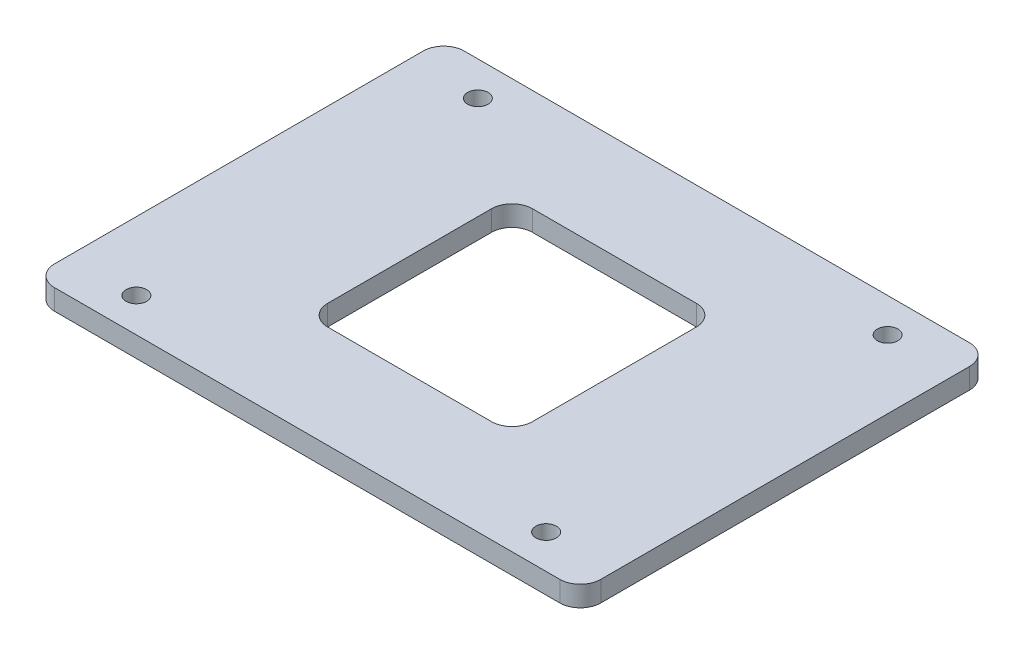
ISO-10303-21;
HEADER;
FILE_DESCRIPTION(('STEP AP214'),'2;1');
FILE_NAME('part.step','',(''),(''),'','','');
FILE_SCHEMA(('AUTOMOTIVE_DESIGN { 1 0 10303 214 1 1 1 1 }'));
ENDSEC;
DATA;
#1=APPLICATION_CONTEXT('core data for automotive mechanical design processes');
#2=APPLICATION_PROTOCOL_DEFINITION('international standard','automotive_design',2000,#1);
#3=PRODUCT_CONTEXT('',#1,'mechanical');
#4=PRODUCT('Part','Part','',(#3));
#5=PRODUCT_RELATED_PRODUCT_CATEGORY('part','',(#4));
#6=PRODUCT_DEFINITION_FORMATION('','',#4);
#7=PRODUCT_DEFINITION_CONTEXT('part definition',#1,'design');
#8=PRODUCT_DEFINITION('design','',#6,#7);
#9=PRODUCT_DEFINITION_SHAPE('','',#8);
#10=(LENGTH_UNIT() NAMED_UNIT(*) SI_UNIT(.MILLI.,.METRE.));
#11=(NAMED_UNIT(*) PLANE_ANGLE_UNIT() SI_UNIT($,.RADIAN.));
#12=(NAMED_UNIT(*) SI_UNIT($,.STERADIAN.) SOLID_ANGLE_UNIT());
#13=UNCERTAINTY_MEASURE_WITH_UNIT(LENGTH_MEASURE(1.E-05),#10,'distance_accuracy_value','');
#14=(GEOMETRIC_REPRESENTATION_CONTEXT(3) GLOBAL_UNCERTAINTY_ASSIGNED_CONTEXT((#13)) GLOBAL_UNIT_ASSIGNED_CONTEXT((#10,
#11,#12)) REPRESENTATION_CONTEXT('',''));
#15=CARTESIAN_POINT('',(0.,0.,0.));
#16=DIRECTION('',(0.,0.,1.));
#17=DIRECTION('',(1.,0.,0.));
#18=AXIS2_PLACEMENT_3D('',#15,#16,#17);
#19=CARTESIAN_POINT('',(0.,3.,0.));
#20=DIRECTION('',(0.,-1.,0.));
#21=DIRECTION('',(0.,0.,-1.));
#22=AXIS2_PLACEMENT_3D('',#19,#20,#21);
#23=PLANE('',#22);
#24=CARTESIAN_POINT('',(-30.,3.,25.));
#25=DIRECTION('',(0.,1.,0.));
#26=DIRECTION('',(0.,0.,-1.));
#27=AXIS2_PLACEMENT_3D('',#24,#25,#26);
#28=CIRCLE('',#27,1.5);
#29=CARTESIAN_POINT('',(-30.,3.,23.5));
#30=VERTEX_POINT('',#29);
#31=EDGE_CURVE('E327',#30,#30,#28,.T.);
#32=ORIENTED_EDGE('',*,*,#31,.F.);
#33=EDGE_LOOP('',(#32));
#34=FACE_BOUND('',#33,.T.);
#35=CARTESIAN_POINT('',(30.,3.,25.));
#36=DIRECTION('',(0.,1.,0.));
#37=DIRECTION('',(0.,0.,1.));
#38=AXIS2_PLACEMENT_3D('',#35,#36,#37);
#39=CIRCLE('',#38,1.5);
#40=CARTESIAN_POINT('',(30.,3.,26.5));
#41=VERTEX_POINT('',#40);
#42=EDGE_CURVE('E335',#41,#41,#39,.T.);
#43=ORIENTED_EDGE('',*,*,#42,.F.);
#44=EDGE_LOOP('',(#43));
#45=FACE_BOUND('',#44,.T.);
#46=CARTESIAN_POINT('',(30.,3.,-25.));
#47=DIRECTION('',(0.,1.,0.));
#48=DIRECTION('',(0.,0.,-1.));
#49=AXIS2_PLACEMENT_3D('',#46,#47,#48);
#50=CIRCLE('',#49,1.5);
#51=CARTESIAN_POINT('',(30.,3.,-26.5));
#52=VERTEX_POINT('',#51);
#53=EDGE_CURVE('E343',#52,#52,#50,.T.);
#54=ORIENTED_EDGE('',*,*,#53,.F.);
#55=EDGE_LOOP('',(#54));
#56=FACE_BOUND('',#55,.T.);
#57=CARTESIAN_POINT('',(-30.,3.,-25.));
#58=DIRECTION('',(0.,1.,0.));
#59=DIRECTION('',(0.,0.,1.));
#60=AXIS2_PLACEMENT_3D('',#57,#58,#59);
#61=CIRCLE('',#60,1.5);
#62=CARTESIAN_POINT('',(-30.,3.,-23.5));
#63=VERTEX_POINT('',#62);
#64=EDGE_CURVE('E351',#63,#63,#61,.T.);
#65=ORIENTED_EDGE('',*,*,#64,.F.);
#66=EDGE_LOOP('',(#65));
#67=FACE_BOUND('',#66,.T.);
#68=DIRECTION('',(-1.,0.,0.));
#69=VECTOR('',#68,1.);
#70=CARTESIAN_POINT('',(-40.,3.,-30.));
#71=LINE('',#70,#69);
#72=CARTESIAN_POINT('',(37.,3.,-30.));
#73=VERTEX_POINT('',#72);
#74=CARTESIAN_POINT('',(-37.,3.,-30.));
#75=VERTEX_POINT('',#74);
#76=EDGE_CURVE('E361',#73,#75,#71,.T.);
#77=ORIENTED_EDGE('',*,*,#76,.T.);
#78=CARTESIAN_POINT('',(-37.,3.,-27.));
#79=DIRECTION('',(0.,-1.,0.));
#80=DIRECTION('',(0.,0.,-1.));
#81=AXIS2_PLACEMENT_3D('',#78,#79,#80);
#82=CIRCLE('',#81,3.);
#83=CARTESIAN_POINT('',(-40.,3.,-27.));
#84=VERTEX_POINT('',#83);
#85=EDGE_CURVE('E222',#75,#84,#82,.F.);
#86=ORIENTED_EDGE('',*,*,#85,.T.);
#87=DIRECTION('',(0.,0.,1.));
#88=VECTOR('',#87,1.);
#89=CARTESIAN_POINT('',(-40.,3.,30.));
#90=LINE('',#89,#88);
#91=CARTESIAN_POINT('',(-40.,3.,27.));
#92=VERTEX_POINT('',#91);
#93=EDGE_CURVE('E177',#84,#92,#90,.T.);
#94=ORIENTED_EDGE('',*,*,#93,.T.);
#95=CARTESIAN_POINT('',(-37.,3.,27.));
#96=DIRECTION('',(0.,-1.,0.));
#97=DIRECTION('',(0.,0.,-1.));
#98=AXIS2_PLACEMENT_3D('',#95,#96,#97);
#99=CIRCLE('',#98,3.);
#100=CARTESIAN_POINT('',(-37.,3.,30.));
#101=VERTEX_POINT('',#100);
#102=EDGE_CURVE('E219',#92,#101,#99,.F.);
#103=ORIENTED_EDGE('',*,*,#102,.T.);
#104=DIRECTION('',(1.,0.,0.));
#105=VECTOR('',#104,1.);
#106=CARTESIAN_POINT('',(-40.,3.,30.));
#107=LINE('',#106,#105);
#108=CARTESIAN_POINT('',(37.,3.,30.));
#109=VERTEX_POINT('',#108);
#110=EDGE_CURVE('E199',#101,#109,#107,.T.);
#111=ORIENTED_EDGE('',*,*,#110,.T.);
#112=CARTESIAN_POINT('',(37.,3.,27.));
#113=DIRECTION('',(0.,-1.,0.));
#114=DIRECTION('',(0.,0.,-1.));
#115=AXIS2_PLACEMENT_3D('',#112,#113,#114);
#116=CIRCLE('',#115,3.);
#117=CARTESIAN_POINT('',(40.,3.,27.));
#118=VERTEX_POINT('',#117);
#119=EDGE_CURVE('E213',#109,#118,#116,.F.);
#120=ORIENTED_EDGE('',*,*,#119,.T.);
#121=DIRECTION('',(0.,0.,-1.));
#122=VECTOR('',#121,1.);
#123=CARTESIAN_POINT('',(40.,3.,30.));
#124=LINE('',#123,#122);
#125=CARTESIAN_POINT('',(40.,3.,-27.));
#126=VERTEX_POINT('',#125);
#127=EDGE_CURVE('E192',#118,#126,#124,.T.);
#128=ORIENTED_EDGE('',*,*,#127,.T.);
#129=CARTESIAN_POINT('',(37.,3.,-27.));
#130=DIRECTION('',(0.,-1.,0.));
#131=DIRECTION('',(0.,0.,-1.));
#132=AXIS2_PLACEMENT_3D('',#129,#130,#131);
#133=CIRCLE('',#132,3.);
#134=EDGE_CURVE('E216',#126,#73,#133,.F.);
#135=ORIENTED_EDGE('',*,*,#134,.T.);
#136=EDGE_LOOP('',(#77,#86,#94,#103,#111,#120,#128,#135));
#137=FACE_BOUND('',#136,.T.);
#138=DIRECTION('',(0.,0.,-1.));
#139=VECTOR('',#138,1.);
#140=CARTESIAN_POINT('',(15.,3.,15.));
#141=LINE('',#140,#139);
#142=CARTESIAN_POINT('',(15.,3.,12.));
#143=VERTEX_POINT('',#142);
#144=CARTESIAN_POINT('',(15.,3.,-12.));
#145=VERTEX_POINT('',#144);
#146=EDGE_CURVE('E302',#143,#145,#141,.T.);
#147=ORIENTED_EDGE('',*,*,#146,.F.);
#148=CARTESIAN_POINT('',(12.,3.,12.));
#149=DIRECTION('',(0.,-1.,0.));
#150=DIRECTION('',(0.,0.,-1.));
#151=AXIS2_PLACEMENT_3D('',#148,#149,#150);
#152=CIRCLE('',#151,3.);
#153=CARTESIAN_POINT('',(12.,3.,15.));
#154=VERTEX_POINT('',#153);
#155=EDGE_CURVE('E281',#143,#154,#152,.T.);
#156=ORIENTED_EDGE('',*,*,#155,.T.);
#157=DIRECTION('',(1.,0.,0.));
#158=VECTOR('',#157,1.);
#159=CARTESIAN_POINT('',(-15.,3.,15.));
#160=LINE('',#159,#158);
#161=CARTESIAN_POINT('',(-12.,3.,15.));
#162=VERTEX_POINT('',#161);
#163=EDGE_CURVE('E318',#162,#154,#160,.T.);
#164=ORIENTED_EDGE('',*,*,#163,.F.);
#165=CARTESIAN_POINT('',(-12.,3.,12.));
#166=DIRECTION('',(0.,-1.,0.));
#167=DIRECTION('',(0.,0.,-1.));
#168=AXIS2_PLACEMENT_3D('',#165,#166,#167);
#169=CIRCLE('',#168,3.);
#170=CARTESIAN_POINT('',(-15.,3.,12.));
#171=VERTEX_POINT('',#170);
#172=EDGE_CURVE('E275',#162,#171,#169,.T.);
#173=ORIENTED_EDGE('',*,*,#172,.T.);
#174=DIRECTION('',(0.,0.,1.));
#175=VECTOR('',#174,1.);
#176=CARTESIAN_POINT('',(-15.,3.,15.));
#177=LINE('',#176,#175);
#178=CARTESIAN_POINT('',(-15.,3.,-12.));
#179=VERTEX_POINT('',#178);
#180=EDGE_CURVE('E310',#179,#171,#177,.T.);
#181=ORIENTED_EDGE('',*,*,#180,.F.);
#182=CARTESIAN_POINT('',(-12.,3.,-12.));
#183=DIRECTION('',(0.,-1.,0.));
#184=DIRECTION('',(0.,0.,-1.));
#185=AXIS2_PLACEMENT_3D('',#182,#183,#184);
#186=CIRCLE('',#185,3.);
#187=CARTESIAN_POINT('',(-12.,3.,-15.));
#188=VERTEX_POINT('',#187);
#189=EDGE_CURVE('E269',#179,#188,#186,.T.);
#190=ORIENTED_EDGE('',*,*,#189,.T.);
#191=DIRECTION('',(-1.,0.,0.));
#192=VECTOR('',#191,1.);
#193=CARTESIAN_POINT('',(-15.,3.,-15.));
#194=LINE('',#193,#192);
#195=CARTESIAN_POINT('',(12.,3.,-15.));
#196=VERTEX_POINT('',#195);
#197=EDGE_CURVE('E305',#196,#188,#194,.T.);
#198=ORIENTED_EDGE('',*,*,#197,.F.);
#199=CARTESIAN_POINT('',(12.,3.,-12.));
#200=DIRECTION('',(0.,-1.,0.));
#201=DIRECTION('',(0.,0.,-1.));
#202=AXIS2_PLACEMENT_3D('',#199,#200,#201);
#203=CIRCLE('',#202,3.);
#204=EDGE_CURVE('E11',#196,#145,#203,.T.);
#205=ORIENTED_EDGE('',*,*,#204,.T.);
#206=EDGE_LOOP('',(#147,#156,#164,#173,#181,#190,#198,#205));
#207=FACE_BOUND('',#206,.T.);
#208=ADVANCED_FACE('F42',(#34,#45,#56,#67,#137,#207),#23,.F.);
#209=CARTESIAN_POINT('',(0.,0.,0.));
#210=DIRECTION('',(0.,-1.,0.));
#211=DIRECTION('',(0.,0.,-1.));
#212=AXIS2_PLACEMENT_3D('',#209,#210,#211);
#213=PLANE('',#212);
#214=CARTESIAN_POINT('',(30.,0.,25.));
#215=DIRECTION('',(0.,1.,0.));
#216=DIRECTION('',(0.,0.,1.));
#217=AXIS2_PLACEMENT_3D('',#214,#215,#216);
#218=CIRCLE('',#217,1.5);
#219=CARTESIAN_POINT('',(30.,0.,26.5));
#220=VERTEX_POINT('',#219);
#221=EDGE_CURVE('E331',#220,#220,#218,.T.);
#222=ORIENTED_EDGE('',*,*,#221,.T.);
#223=EDGE_LOOP('',(#222));
#224=FACE_BOUND('',#223,.T.);
#225=CARTESIAN_POINT('',(-30.,0.,-25.));
#226=DIRECTION('',(0.,1.,0.));
#227=DIRECTION('',(0.,0.,1.));
#228=AXIS2_PLACEMENT_3D('',#225,#226,#227);
#229=CIRCLE('',#228,1.5);
#230=CARTESIAN_POINT('',(-30.,0.,-23.5));
#231=VERTEX_POINT('',#230);
#232=EDGE_CURVE('E347',#231,#231,#229,.T.);
#233=ORIENTED_EDGE('',*,*,#232,.T.);
#234=EDGE_LOOP('',(#233));
#235=FACE_BOUND('',#234,.T.);
#236=DIRECTION('',(0.,0.,1.));
#237=VECTOR('',#236,1.);
#238=CARTESIAN_POINT('',(-40.,0.,30.));
#239=LINE('',#238,#237);
#240=CARTESIAN_POINT('',(-40.,0.,-27.));
#241=VERTEX_POINT('',#240);
#242=CARTESIAN_POINT('',(-40.,0.,27.));
#243=VERTEX_POINT('',#242);
#244=EDGE_CURVE('E174',#241,#243,#239,.T.);
#245=ORIENTED_EDGE('',*,*,#244,.F.);
#246=CARTESIAN_POINT('',(-37.,0.,-27.));
#247=DIRECTION('',(0.,-1.,0.));
#248=DIRECTION('',(0.,0.,-1.));
#249=AXIS2_PLACEMENT_3D('',#246,#247,#248);
#250=CIRCLE('',#249,3.);
#251=CARTESIAN_POINT('',(-37.,0.,-30.));
#252=VERTEX_POINT('',#251);
#253=EDGE_CURVE('E156',#241,#252,#250,.T.);
#254=ORIENTED_EDGE('',*,*,#253,.T.);
#255=DIRECTION('',(-1.,0.,0.));
#256=VECTOR('',#255,1.);
#257=CARTESIAN_POINT('',(-40.,0.,-30.));
#258=LINE('',#257,#256);
#259=CARTESIAN_POINT('',(37.,0.,-30.));
#260=VERTEX_POINT('',#259);
#261=EDGE_CURVE('E187',#260,#252,#258,.T.);
#262=ORIENTED_EDGE('',*,*,#261,.F.);
#263=CARTESIAN_POINT('',(37.,0.,-27.));
#264=DIRECTION('',(0.,-1.,0.));
#265=DIRECTION('',(0.,0.,-1.));
#266=AXIS2_PLACEMENT_3D('',#263,#264,#265);
#267=CIRCLE('',#266,3.);
#268=CARTESIAN_POINT('',(40.,0.,-27.));
#269=VERTEX_POINT('',#268);
#270=EDGE_CURVE('E203',#260,#269,#267,.T.);
#271=ORIENTED_EDGE('',*,*,#270,.T.);
#272=DIRECTION('',(0.,0.,-1.));
#273=VECTOR('',#272,1.);
#274=CARTESIAN_POINT('',(40.,0.,30.));
#275=LINE('',#274,#273);
#276=CARTESIAN_POINT('',(40.,0.,27.));
#277=VERTEX_POINT('',#276);
#278=EDGE_CURVE('E194',#277,#269,#275,.T.);
#279=ORIENTED_EDGE('',*,*,#278,.F.);
#280=CARTESIAN_POINT('',(37.,0.,27.));
#281=DIRECTION('',(0.,-1.,0.));
#282=DIRECTION('',(0.,0.,-1.));
#283=AXIS2_PLACEMENT_3D('',#280,#281,#282);
#284=CIRCLE('',#283,3.);
#285=CARTESIAN_POINT('',(37.,0.,30.));
#286=VERTEX_POINT('',#285);
#287=EDGE_CURVE('E179',#277,#286,#284,.T.);
#288=ORIENTED_EDGE('',*,*,#287,.T.);
#289=DIRECTION('',(1.,0.,0.));
#290=VECTOR('',#289,1.);
#291=CARTESIAN_POINT('',(-40.,0.,30.));
#292=LINE('',#291,#290);
#293=CARTESIAN_POINT('',(-37.,0.,30.));
#294=VERTEX_POINT('',#293);
#295=EDGE_CURVE('E186',#294,#286,#292,.T.);
#296=ORIENTED_EDGE('',*,*,#295,.F.);
#297=CARTESIAN_POINT('',(-37.,0.,27.));
#298=DIRECTION('',(0.,-1.,0.));
#299=DIRECTION('',(0.,0.,-1.));
#300=AXIS2_PLACEMENT_3D('',#297,#298,#299);
#301=CIRCLE('',#300,3.);
#302=EDGE_CURVE('E168',#294,#243,#301,.T.);
#303=ORIENTED_EDGE('',*,*,#302,.T.);
#304=EDGE_LOOP('',(#245,#254,#262,#271,#279,#288,#296,#303));
#305=FACE_BOUND('',#304,.T.);
#306=CARTESIAN_POINT('',(30.,0.,-25.));
#307=DIRECTION('',(0.,1.,0.));
#308=DIRECTION('',(0.,0.,-1.));
#309=AXIS2_PLACEMENT_3D('',#306,#307,#308);
#310=CIRCLE('',#309,1.5);
#311=CARTESIAN_POINT('',(30.,0.,-26.5));
#312=VERTEX_POINT('',#311);
#313=EDGE_CURVE('E339',#312,#312,#310,.T.);
#314=ORIENTED_EDGE('',*,*,#313,.T.);
#315=EDGE_LOOP('',(#314));
#316=FACE_BOUND('',#315,.T.);
#317=CARTESIAN_POINT('',(-30.,0.,25.));
#318=DIRECTION('',(0.,1.,0.));
#319=DIRECTION('',(0.,0.,-1.));
#320=AXIS2_PLACEMENT_3D('',#317,#318,#319);
#321=CIRCLE('',#320,1.5);
#322=CARTESIAN_POINT('',(-30.,0.,23.5));
#323=VERTEX_POINT('',#322);
#324=EDGE_CURVE('E322',#323,#323,#321,.T.);
#325=ORIENTED_EDGE('',*,*,#324,.T.);
#326=EDGE_LOOP('',(#325));
#327=FACE_BOUND('',#326,.T.);
#328=DIRECTION('',(0.,0.,1.));
#329=VECTOR('',#328,1.);
#330=CARTESIAN_POINT('',(-15.,0.,15.));
#331=LINE('',#330,#329);
#332=CARTESIAN_POINT('',(-15.,0.,-12.));
#333=VERTEX_POINT('',#332);
#334=CARTESIAN_POINT('',(-15.,0.,12.));
#335=VERTEX_POINT('',#334);
#336=EDGE_CURVE('E299',#333,#335,#331,.T.);
#337=ORIENTED_EDGE('',*,*,#336,.T.);
#338=CARTESIAN_POINT('',(-12.,0.,12.));
#339=DIRECTION('',(0.,-1.,0.));
#340=DIRECTION('',(0.,0.,-1.));
#341=AXIS2_PLACEMENT_3D('',#338,#339,#340);
#342=CIRCLE('',#341,3.);
#343=CARTESIAN_POINT('',(-12.,0.,15.));
#344=VERTEX_POINT('',#343);
#345=EDGE_CURVE('E272',#335,#344,#342,.F.);
#346=ORIENTED_EDGE('',*,*,#345,.T.);
#347=DIRECTION('',(1.,0.,0.));
#348=VECTOR('',#347,1.);
#349=CARTESIAN_POINT('',(-15.,0.,15.));
#350=LINE('',#349,#348);
#351=CARTESIAN_POINT('',(12.,0.,15.));
#352=VERTEX_POINT('',#351);
#353=EDGE_CURVE('E306',#344,#352,#350,.T.);
#354=ORIENTED_EDGE('',*,*,#353,.T.);
#355=CARTESIAN_POINT('',(12.,0.,12.));
#356=DIRECTION('',(0.,-1.,0.));
#357=DIRECTION('',(0.,0.,-1.));
#358=AXIS2_PLACEMENT_3D('',#355,#356,#357);
#359=CIRCLE('',#358,3.);
#360=CARTESIAN_POINT('',(15.,0.,12.));
#361=VERTEX_POINT('',#360);
#362=EDGE_CURVE('E278',#352,#361,#359,.F.);
#363=ORIENTED_EDGE('',*,*,#362,.T.);
#364=DIRECTION('',(0.,0.,-1.));
#365=VECTOR('',#364,1.);
#366=CARTESIAN_POINT('',(15.,0.,15.));
#367=LINE('',#366,#365);
#368=CARTESIAN_POINT('',(15.,0.,-12.));
#369=VERTEX_POINT('',#368);
#370=EDGE_CURVE('E290',#361,#369,#367,.T.);
#371=ORIENTED_EDGE('',*,*,#370,.T.);
#372=CARTESIAN_POINT('',(12.,0.,-12.));
#373=DIRECTION('',(0.,-1.,0.));
#374=DIRECTION('',(0.,0.,-1.));
#375=AXIS2_PLACEMENT_3D('',#372,#373,#374);
#376=CIRCLE('',#375,3.);
#377=CARTESIAN_POINT('',(12.,0.,-15.));
#378=VERTEX_POINT('',#377);
#379=EDGE_CURVE('E51',#369,#378,#376,.F.);
#380=ORIENTED_EDGE('',*,*,#379,.T.);
#381=DIRECTION('',(-1.,0.,0.));
#382=VECTOR('',#381,1.);
#383=CARTESIAN_POINT('',(-15.,0.,-15.));
#384=LINE('',#383,#382);
#385=CARTESIAN_POINT('',(-12.,0.,-15.));
#386=VERTEX_POINT('',#385);
#387=EDGE_CURVE('E289',#378,#386,#384,.T.);
#388=ORIENTED_EDGE('',*,*,#387,.T.);
#389=CARTESIAN_POINT('',(-12.,0.,-12.));
#390=DIRECTION('',(0.,-1.,0.));
#391=DIRECTION('',(0.,0.,-1.));
#392=AXIS2_PLACEMENT_3D('',#389,#390,#391);
#393=CIRCLE('',#392,3.);
#394=EDGE_CURVE('E266',#386,#333,#393,.F.);
#395=ORIENTED_EDGE('',*,*,#394,.T.);
#396=EDGE_LOOP('',(#337,#346,#354,#363,#371,#380,#388,#395));
#397=FACE_BOUND('',#396,.T.);
#398=ADVANCED_FACE('F182',(#224,#235,#305,#316,#327,#397),#213,.T.);
#399=CARTESIAN_POINT('',(40.,3.,30.));
#400=DIRECTION('',(-1.,0.,0.));
#401=DIRECTION('',(0.,0.,1.));
#402=AXIS2_PLACEMENT_3D('',#399,#400,#401);
#403=PLANE('',#402);
#404=ORIENTED_EDGE('',*,*,#278,.T.);
#405=DIRECTION('',(0.,-1.,0.));
#406=VECTOR('',#405,1.);
#407=CARTESIAN_POINT('',(40.,3.,-27.));
#408=LINE('',#407,#406);
#409=EDGE_CURVE('E236',#269,#126,#408,.F.);
#410=ORIENTED_EDGE('',*,*,#409,.T.);
#411=ORIENTED_EDGE('',*,*,#127,.F.);
#412=DIRECTION('',(0.,-1.,0.));
#413=VECTOR('',#412,1.);
#414=CARTESIAN_POINT('',(40.,3.,27.));
#415=LINE('',#414,#413);
#416=EDGE_CURVE('E232',#118,#277,#415,.T.);
#417=ORIENTED_EDGE('',*,*,#416,.T.);
#418=EDGE_LOOP('',(#404,#410,#411,#417));
#419=FACE_BOUND('',#418,.T.);
#420=ADVANCED_FACE('F374',(#419),#403,.F.);
#421=CARTESIAN_POINT('',(-40.,3.,-30.));
#422=DIRECTION('',(0.,0.,1.));
#423=DIRECTION('',(1.,0.,0.));
#424=AXIS2_PLACEMENT_3D('',#421,#422,#423);
#425=PLANE('',#424);
#426=ORIENTED_EDGE('',*,*,#261,.T.);
#427=DIRECTION('',(0.,-1.,0.));
#428=VECTOR('',#427,1.);
#429=CARTESIAN_POINT('',(-37.,3.,-30.));
#430=LINE('',#429,#428);
#431=EDGE_CURVE('E161',#252,#75,#430,.F.);
#432=ORIENTED_EDGE('',*,*,#431,.T.);
#433=ORIENTED_EDGE('',*,*,#76,.F.);
#434=DIRECTION('',(0.,-1.,0.));
#435=VECTOR('',#434,1.);
#436=CARTESIAN_POINT('',(37.,3.,-30.));
#437=LINE('',#436,#435);
#438=EDGE_CURVE('E167',#73,#260,#437,.T.);
#439=ORIENTED_EDGE('',*,*,#438,.T.);
#440=EDGE_LOOP('',(#426,#432,#433,#439));
#441=FACE_BOUND('',#440,.T.);
#442=ADVANCED_FACE('F384',(#441),#425,.F.);
#443=CARTESIAN_POINT('',(-40.,3.,30.));
#444=DIRECTION('',(1.,0.,0.));
#445=DIRECTION('',(0.,0.,-1.));
#446=AXIS2_PLACEMENT_3D('',#443,#444,#445);
#447=PLANE('',#446);
#448=ORIENTED_EDGE('',*,*,#93,.F.);
#449=DIRECTION('',(0.,-1.,0.));
#450=VECTOR('',#449,1.);
#451=CARTESIAN_POINT('',(-40.,3.,-27.));
#452=LINE('',#451,#450);
#453=EDGE_CURVE('E160',#84,#241,#452,.T.);
#454=ORIENTED_EDGE('',*,*,#453,.T.);
#455=ORIENTED_EDGE('',*,*,#244,.T.);
#456=DIRECTION('',(0.,-1.,0.));
#457=VECTOR('',#456,1.);
#458=CARTESIAN_POINT('',(-40.,3.,27.));
#459=LINE('',#458,#457);
#460=EDGE_CURVE('E180',#243,#92,#459,.F.);
#461=ORIENTED_EDGE('',*,*,#460,.T.);
#462=EDGE_LOOP('',(#448,#454,#455,#461));
#463=FACE_BOUND('',#462,.T.);
#464=ADVANCED_FACE('F173',(#463),#447,.F.);
#465=CARTESIAN_POINT('',(-40.,3.,30.));
#466=DIRECTION('',(0.,0.,-1.));
#467=DIRECTION('',(-1.,0.,0.));
#468=AXIS2_PLACEMENT_3D('',#465,#466,#467);
#469=PLANE('',#468);
#470=ORIENTED_EDGE('',*,*,#110,.F.);
#471=DIRECTION('',(0.,-1.,0.));
#472=VECTOR('',#471,1.);
#473=CARTESIAN_POINT('',(-37.,3.,30.));
#474=LINE('',#473,#472);
#475=EDGE_CURVE('E228',#101,#294,#474,.T.);
#476=ORIENTED_EDGE('',*,*,#475,.T.);
#477=ORIENTED_EDGE('',*,*,#295,.T.);
#478=DIRECTION('',(0.,-1.,0.));
#479=VECTOR('',#478,1.);
#480=CARTESIAN_POINT('',(37.,3.,30.));
#481=LINE('',#480,#479);
#482=EDGE_CURVE('E225',#286,#109,#481,.F.);
#483=ORIENTED_EDGE('',*,*,#482,.T.);
#484=EDGE_LOOP('',(#470,#476,#477,#483));
#485=FACE_BOUND('',#484,.T.);
#486=ADVANCED_FACE('F391',(#485),#469,.F.);
#487=CARTESIAN_POINT('',(-30.,3.,-25.));
#488=DIRECTION('',(0.,-1.,0.));
#489=DIRECTION('',(0.,0.,-1.));
#490=AXIS2_PLACEMENT_3D('',#487,#488,#489);
#491=CYLINDRICAL_SURFACE('',#490,1.5);
#492=ORIENTED_EDGE('',*,*,#64,.T.);
#493=EDGE_LOOP('',(#492));
#494=FACE_BOUND('',#493,.T.);
#495=ORIENTED_EDGE('',*,*,#232,.F.);
#496=EDGE_LOOP('',(#495));
#497=FACE_BOUND('',#496,.T.);
#498=ADVANCED_FACE('F405',(#494,#497),#491,.F.);
#499=CARTESIAN_POINT('',(30.,3.,-25.));
#500=DIRECTION('',(0.,-1.,0.));
#501=DIRECTION('',(0.,0.,-1.));
#502=AXIS2_PLACEMENT_3D('',#499,#500,#501);
#503=CYLINDRICAL_SURFACE('',#502,1.5);
#504=ORIENTED_EDGE('',*,*,#53,.T.);
#505=EDGE_LOOP('',(#504));
#506=FACE_BOUND('',#505,.T.);
#507=ORIENTED_EDGE('',*,*,#313,.F.);
#508=EDGE_LOOP('',(#507));
#509=FACE_BOUND('',#508,.T.);
#510=ADVANCED_FACE('F413',(#506,#509),#503,.F.);
#511=CARTESIAN_POINT('',(30.,3.,25.));
#512=DIRECTION('',(0.,-1.,0.));
#513=DIRECTION('',(0.,0.,-1.));
#514=AXIS2_PLACEMENT_3D('',#511,#512,#513);
#515=CYLINDRICAL_SURFACE('',#514,1.5);
#516=ORIENTED_EDGE('',*,*,#42,.T.);
#517=EDGE_LOOP('',(#516));
#518=FACE_BOUND('',#517,.T.);
#519=ORIENTED_EDGE('',*,*,#221,.F.);
#520=EDGE_LOOP('',(#519));
#521=FACE_BOUND('',#520,.T.);
#522=ADVANCED_FACE('F476',(#518,#521),#515,.F.);
#523=CARTESIAN_POINT('',(-30.,3.,25.));
#524=DIRECTION('',(0.,-1.,0.));
#525=DIRECTION('',(0.,0.,-1.));
#526=AXIS2_PLACEMENT_3D('',#523,#524,#525);
#527=CYLINDRICAL_SURFACE('',#526,1.5);
#528=ORIENTED_EDGE('',*,*,#31,.T.);
#529=EDGE_LOOP('',(#528));
#530=FACE_BOUND('',#529,.T.);
#531=ORIENTED_EDGE('',*,*,#324,.F.);
#532=EDGE_LOOP('',(#531));
#533=FACE_BOUND('',#532,.T.);
#534=ADVANCED_FACE('F473',(#530,#533),#527,.F.);
#535=CARTESIAN_POINT('',(15.,3.,15.));
#536=DIRECTION('',(-1.,0.,0.));
#537=DIRECTION('',(0.,0.,1.));
#538=AXIS2_PLACEMENT_3D('',#535,#536,#537);
#539=PLANE('',#538);
#540=ORIENTED_EDGE('',*,*,#370,.F.);
#541=DIRECTION('',(0.,-1.,0.));
#542=VECTOR('',#541,1.);
#543=CARTESIAN_POINT('',(15.,3.,12.));
#544=LINE('',#543,#542);
#545=EDGE_CURVE('E63',#361,#143,#544,.F.);
#546=ORIENTED_EDGE('',*,*,#545,.T.);
#547=ORIENTED_EDGE('',*,*,#146,.T.);
#548=DIRECTION('',(0.,-1.,0.));
#549=VECTOR('',#548,1.);
#550=CARTESIAN_POINT('',(15.,0.,-12.));
#551=LINE('',#550,#549);
#552=EDGE_CURVE('E260',#145,#369,#551,.T.);
#553=ORIENTED_EDGE('',*,*,#552,.T.);
#554=EDGE_LOOP('',(#540,#546,#547,#553));
#555=FACE_BOUND('',#554,.T.);
#556=ADVANCED_FACE('F301',(#555),#539,.T.);
#557=CARTESIAN_POINT('',(-15.,3.,-15.));
#558=DIRECTION('',(0.,0.,1.));
#559=DIRECTION('',(1.,0.,0.));
#560=AXIS2_PLACEMENT_3D('',#557,#558,#559);
#561=PLANE('',#560);
#562=ORIENTED_EDGE('',*,*,#197,.T.);
#563=DIRECTION('',(0.,-1.,0.));
#564=VECTOR('',#563,1.);
#565=CARTESIAN_POINT('',(-12.,0.,-15.));
#566=LINE('',#565,#564);
#567=EDGE_CURVE('E242',#188,#386,#566,.T.);
#568=ORIENTED_EDGE('',*,*,#567,.T.);
#569=ORIENTED_EDGE('',*,*,#387,.F.);
#570=DIRECTION('',(0.,-1.,0.));
#571=VECTOR('',#570,1.);
#572=CARTESIAN_POINT('',(12.,3.,-15.));
#573=LINE('',#572,#571);
#574=EDGE_CURVE('E239',#378,#196,#573,.F.);
#575=ORIENTED_EDGE('',*,*,#574,.T.);
#576=EDGE_LOOP('',(#562,#568,#569,#575));
#577=FACE_BOUND('',#576,.T.);
#578=ADVANCED_FACE('F296',(#577),#561,.T.);
#579=CARTESIAN_POINT('',(-15.,3.,15.));
#580=DIRECTION('',(1.,0.,0.));
#581=DIRECTION('',(0.,0.,-1.));
#582=AXIS2_PLACEMENT_3D('',#579,#580,#581);
#583=PLANE('',#582);
#584=ORIENTED_EDGE('',*,*,#336,.F.);
#585=DIRECTION('',(0.,-1.,0.));
#586=VECTOR('',#585,1.);
#587=CARTESIAN_POINT('',(-15.,3.,-12.));
#588=LINE('',#587,#586);
#589=EDGE_CURVE('E250',#333,#179,#588,.F.);
#590=ORIENTED_EDGE('',*,*,#589,.T.);
#591=ORIENTED_EDGE('',*,*,#180,.T.);
#592=DIRECTION('',(0.,-1.,0.));
#593=VECTOR('',#592,1.);
#594=CARTESIAN_POINT('',(-15.,0.,12.));
#595=LINE('',#594,#593);
#596=EDGE_CURVE('E246',#171,#335,#595,.T.);
#597=ORIENTED_EDGE('',*,*,#596,.T.);
#598=EDGE_LOOP('',(#584,#590,#591,#597));
#599=FACE_BOUND('',#598,.T.);
#600=ADVANCED_FACE('F460',(#599),#583,.T.);
#601=CARTESIAN_POINT('',(-15.,3.,15.));
#602=DIRECTION('',(0.,0.,-1.));
#603=DIRECTION('',(-1.,0.,0.));
#604=AXIS2_PLACEMENT_3D('',#601,#602,#603);
#605=PLANE('',#604);
#606=ORIENTED_EDGE('',*,*,#353,.F.);
#607=DIRECTION('',(0.,-1.,0.));
#608=VECTOR('',#607,1.);
#609=CARTESIAN_POINT('',(-12.,3.,15.));
#610=LINE('',#609,#608);
#611=EDGE_CURVE('E257',#344,#162,#610,.F.);
#612=ORIENTED_EDGE('',*,*,#611,.T.);
#613=ORIENTED_EDGE('',*,*,#163,.T.);
#614=DIRECTION('',(0.,-1.,0.));
#615=VECTOR('',#614,1.);
#616=CARTESIAN_POINT('',(12.,0.,15.));
#617=LINE('',#616,#615);
#618=EDGE_CURVE('E253',#154,#352,#617,.T.);
#619=ORIENTED_EDGE('',*,*,#618,.T.);
#620=EDGE_LOOP('',(#606,#612,#613,#619));
#621=FACE_BOUND('',#620,.T.);
#622=ADVANCED_FACE('F430',(#621),#605,.T.);
#623=CARTESIAN_POINT('',(-37.,3.,-27.));
#624=DIRECTION('',(0.,-1.,0.));
#625=DIRECTION('',(0.,0.,-1.));
#626=AXIS2_PLACEMENT_3D('',#623,#624,#625);
#627=CYLINDRICAL_SURFACE('',#626,3.);
#628=ORIENTED_EDGE('',*,*,#85,.F.);
#629=ORIENTED_EDGE('',*,*,#431,.F.);
#630=ORIENTED_EDGE('',*,*,#253,.F.);
#631=ORIENTED_EDGE('',*,*,#453,.F.);
#632=EDGE_LOOP('',(#628,#629,#630,#631));
#633=FACE_BOUND('',#632,.T.);
#634=ADVANCED_FACE('F159',(#633),#627,.T.);
#635=CARTESIAN_POINT('',(-37.,3.,27.));
#636=DIRECTION('',(0.,-1.,0.));
#637=DIRECTION('',(0.,0.,-1.));
#638=AXIS2_PLACEMENT_3D('',#635,#636,#637);
#639=CYLINDRICAL_SURFACE('',#638,3.);
#640=ORIENTED_EDGE('',*,*,#102,.F.);
#641=ORIENTED_EDGE('',*,*,#460,.F.);
#642=ORIENTED_EDGE('',*,*,#302,.F.);
#643=ORIENTED_EDGE('',*,*,#475,.F.);
#644=EDGE_LOOP('',(#640,#641,#642,#643));
#645=FACE_BOUND('',#644,.T.);
#646=ADVANCED_FACE('F421',(#645),#639,.T.);
#647=CARTESIAN_POINT('',(37.,3.,-27.));
#648=DIRECTION('',(0.,-1.,0.));
#649=DIRECTION('',(0.,0.,-1.));
#650=AXIS2_PLACEMENT_3D('',#647,#648,#649);
#651=CYLINDRICAL_SURFACE('',#650,3.);
#652=ORIENTED_EDGE('',*,*,#134,.F.);
#653=ORIENTED_EDGE('',*,*,#409,.F.);
#654=ORIENTED_EDGE('',*,*,#270,.F.);
#655=ORIENTED_EDGE('',*,*,#438,.F.);
#656=EDGE_LOOP('',(#652,#653,#654,#655));
#657=FACE_BOUND('',#656,.T.);
#658=ADVANCED_FACE('F379',(#657),#651,.T.);
#659=CARTESIAN_POINT('',(37.,3.,27.));
#660=DIRECTION('',(0.,-1.,0.));
#661=DIRECTION('',(0.,0.,-1.));
#662=AXIS2_PLACEMENT_3D('',#659,#660,#661);
#663=CYLINDRICAL_SURFACE('',#662,3.);
#664=ORIENTED_EDGE('',*,*,#119,.F.);
#665=ORIENTED_EDGE('',*,*,#482,.F.);
#666=ORIENTED_EDGE('',*,*,#287,.F.);
#667=ORIENTED_EDGE('',*,*,#416,.F.);
#668=EDGE_LOOP('',(#664,#665,#666,#667));
#669=FACE_BOUND('',#668,.T.);
#670=ADVANCED_FACE('F428',(#669),#663,.T.);
#671=CARTESIAN_POINT('',(-12.,3.,-12.));
#672=DIRECTION('',(0.,1.,0.));
#673=DIRECTION('',(0.,0.,1.));
#674=AXIS2_PLACEMENT_3D('',#671,#672,#673);
#675=CYLINDRICAL_SURFACE('',#674,3.);
#676=ORIENTED_EDGE('',*,*,#189,.F.);
#677=ORIENTED_EDGE('',*,*,#589,.F.);
#678=ORIENTED_EDGE('',*,*,#394,.F.);
#679=ORIENTED_EDGE('',*,*,#567,.F.);
#680=EDGE_LOOP('',(#676,#677,#678,#679));
#681=FACE_BOUND('',#680,.T.);
#682=ADVANCED_FACE('F435',(#681),#675,.F.);
#683=CARTESIAN_POINT('',(-12.,3.,12.));
#684=DIRECTION('',(0.,1.,0.));
#685=DIRECTION('',(0.,0.,1.));
#686=AXIS2_PLACEMENT_3D('',#683,#684,#685);
#687=CYLINDRICAL_SURFACE('',#686,3.);
#688=ORIENTED_EDGE('',*,*,#172,.F.);
#689=ORIENTED_EDGE('',*,*,#611,.F.);
#690=ORIENTED_EDGE('',*,*,#345,.F.);
#691=ORIENTED_EDGE('',*,*,#596,.F.);
#692=EDGE_LOOP('',(#688,#689,#690,#691));
#693=FACE_BOUND('',#692,.T.);
#694=ADVANCED_FACE('F439',(#693),#687,.F.);
#695=CARTESIAN_POINT('',(12.,3.,12.));
#696=DIRECTION('',(0.,1.,0.));
#697=DIRECTION('',(0.,0.,1.));
#698=AXIS2_PLACEMENT_3D('',#695,#696,#697);
#699=CYLINDRICAL_SURFACE('',#698,3.);
#700=ORIENTED_EDGE('',*,*,#155,.F.);
#701=ORIENTED_EDGE('',*,*,#545,.F.);
#702=ORIENTED_EDGE('',*,*,#362,.F.);
#703=ORIENTED_EDGE('',*,*,#618,.F.);
#704=EDGE_LOOP('',(#700,#701,#702,#703));
#705=FACE_BOUND('',#704,.T.);
#706=ADVANCED_FACE('F442',(#705),#699,.F.);
#707=CARTESIAN_POINT('',(12.,3.,-12.));
#708=DIRECTION('',(0.,1.,0.));
#709=DIRECTION('',(0.,0.,1.));
#710=AXIS2_PLACEMENT_3D('',#707,#708,#709);
#711=CYLINDRICAL_SURFACE('',#710,3.);
#712=ORIENTED_EDGE('',*,*,#204,.F.);
#713=ORIENTED_EDGE('',*,*,#574,.F.);
#714=ORIENTED_EDGE('',*,*,#379,.F.);
#715=ORIENTED_EDGE('',*,*,#552,.F.);
#716=EDGE_LOOP('',(#712,#713,#714,#715));
#717=FACE_BOUND('',#716,.T.);
#718=ADVANCED_FACE('F44',(#717),#711,.F.);
#719=CLOSED_SHELL('',(#208,#398,#420,#442,#464,#486,#498,#510,#522,#534,#556,#578,#600,#622,
#634,#646,#658,#670,#682,#694,#706,#718));
#720=MANIFOLD_SOLID_BREP('B2',#719);
#721=ADVANCED_BREP_SHAPE_REPRESENTATION('',(#18,#720),#14);
#722=SHAPE_DEFINITION_REPRESENTATION(#9,#721);
ENDSEC;
END-ISO-10303-21;
